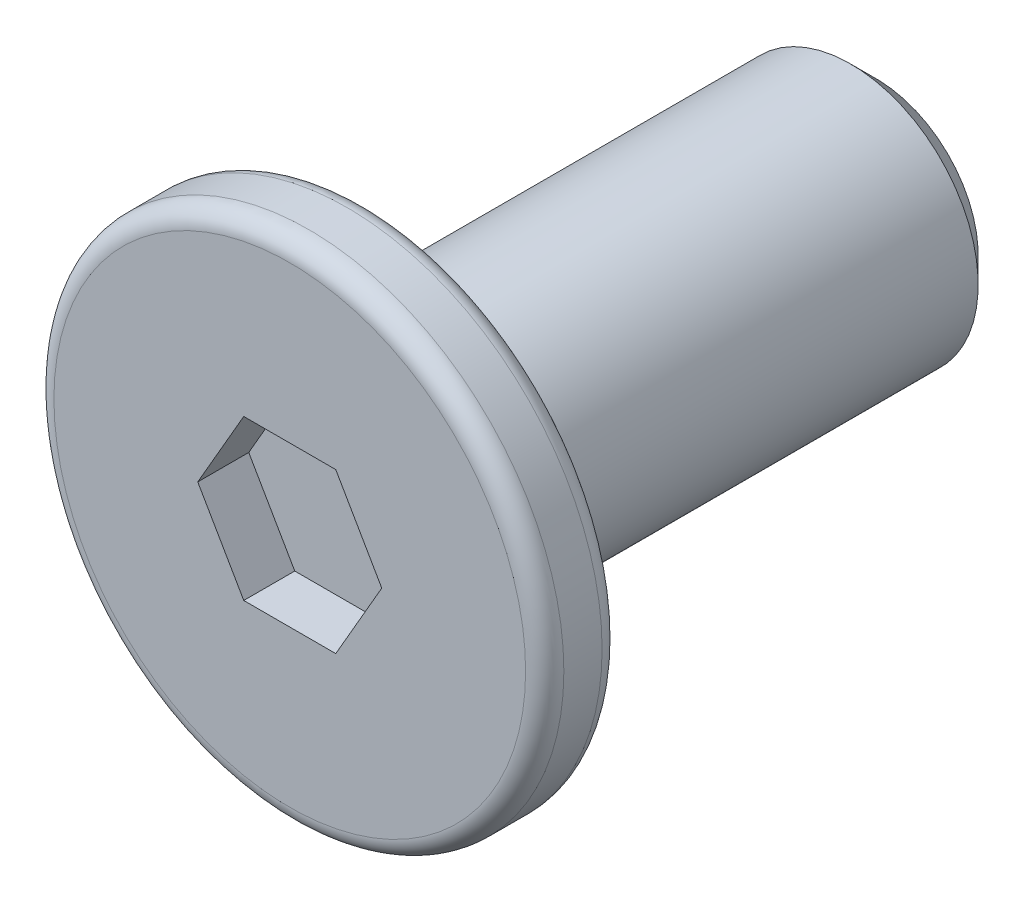
ISO-10303-21;
HEADER;
FILE_DESCRIPTION(('STEP AP214'),'2;1');
FILE_NAME('part.step','',(''),(''),'','','');
FILE_SCHEMA(('AUTOMOTIVE_DESIGN { 1 0 10303 214 1 1 1 1 }'));
ENDSEC;
DATA;
#1=APPLICATION_CONTEXT('core data for automotive mechanical design processes');
#2=APPLICATION_PROTOCOL_DEFINITION('international standard','automotive_design',2000,#1);
#3=PRODUCT_CONTEXT('',#1,'mechanical');
#4=PRODUCT('Part','Part','',(#3));
#5=PRODUCT_RELATED_PRODUCT_CATEGORY('part','',(#4));
#6=PRODUCT_DEFINITION_FORMATION('','',#4);
#7=PRODUCT_DEFINITION_CONTEXT('part definition',#1,'design');
#8=PRODUCT_DEFINITION('design','',#6,#7);
#9=PRODUCT_DEFINITION_SHAPE('','',#8);
#10=(LENGTH_UNIT() NAMED_UNIT(*) SI_UNIT(.MILLI.,.METRE.));
#11=(NAMED_UNIT(*) PLANE_ANGLE_UNIT() SI_UNIT($,.RADIAN.));
#12=(NAMED_UNIT(*) SI_UNIT($,.STERADIAN.) SOLID_ANGLE_UNIT());
#13=UNCERTAINTY_MEASURE_WITH_UNIT(LENGTH_MEASURE(1.E-05),#10,'distance_accuracy_value','');
#14=(GEOMETRIC_REPRESENTATION_CONTEXT(3) GLOBAL_UNCERTAINTY_ASSIGNED_CONTEXT((#13)) GLOBAL_UNIT_ASSIGNED_CONTEXT((#10,
#11,#12)) REPRESENTATION_CONTEXT('',''));
#15=CARTESIAN_POINT('',(0.,0.,0.));
#16=DIRECTION('',(0.,0.,1.));
#17=DIRECTION('',(1.,0.,0.));
#18=AXIS2_PLACEMENT_3D('',#15,#16,#17);
#19=CARTESIAN_POINT('',(0.,0.,0.6));
#20=DIRECTION('',(0.,0.,-1.));
#21=DIRECTION('',(-1.,0.,0.));
#22=AXIS2_PLACEMENT_3D('',#19,#20,#21);
#23=CYLINDRICAL_SURFACE('',#22,4.);
#24=CARTESIAN_POINT('',(0.,0.,-0.3));
#25=DIRECTION('',(0.,0.,1.));
#26=DIRECTION('',(1.,0.,0.));
#27=AXIS2_PLACEMENT_3D('',#24,#25,#26);
#28=CIRCLE('',#27,4.);
#29=CARTESIAN_POINT('',(4.,0.,-0.3));
#30=VERTEX_POINT('',#29);
#31=EDGE_CURVE('E154',#30,#30,#28,.T.);
#32=ORIENTED_EDGE('',*,*,#31,.T.);
#33=EDGE_LOOP('',(#32));
#34=FACE_BOUND('',#33,.T.);
#35=CARTESIAN_POINT('',(0.,0.,0.3));
#36=DIRECTION('',(0.,0.,1.));
#37=DIRECTION('',(1.,0.,0.));
#38=AXIS2_PLACEMENT_3D('',#35,#36,#37);
#39=CIRCLE('',#38,4.);
#40=CARTESIAN_POINT('',(4.,0.,0.3));
#41=VERTEX_POINT('',#40);
#42=EDGE_CURVE('E151',#41,#41,#39,.F.);
#43=ORIENTED_EDGE('',*,*,#42,.T.);
#44=EDGE_LOOP('',(#43));
#45=FACE_BOUND('',#44,.T.);
#46=ADVANCED_FACE('F35',(#34,#45),#23,.T.);
#47=CARTESIAN_POINT('',(0.,0.,0.6));
#48=DIRECTION('',(0.,0.,1.));
#49=DIRECTION('',(1.,0.,0.));
#50=AXIS2_PLACEMENT_3D('',#47,#48,#49);
#51=PLANE('',#50);
#52=CARTESIAN_POINT('',(0.,0.,0.6));
#53=DIRECTION('',(0.,0.,1.));
#54=DIRECTION('',(1.,0.,0.));
#55=AXIS2_PLACEMENT_3D('',#52,#53,#54);
#56=CIRCLE('',#55,3.7);
#57=CARTESIAN_POINT('',(3.7,0.,0.6));
#58=VERTEX_POINT('',#57);
#59=EDGE_CURVE('E11',#58,#58,#56,.T.);
#60=ORIENTED_EDGE('',*,*,#59,.T.);
#61=EDGE_LOOP('',(#60));
#62=FACE_BOUND('',#61,.T.);
#63=DIRECTION('',(0.5,0.866025403784439,0.));
#64=VECTOR('',#63,1.);
#65=CARTESIAN_POINT('',(0.721687836487033,-1.25,0.6));
#66=LINE('',#65,#64);
#67=CARTESIAN_POINT('',(0.721687836487033,-1.25,0.6));
#68=VERTEX_POINT('',#67);
#69=CARTESIAN_POINT('',(1.44337567297407,0.,0.6));
#70=VERTEX_POINT('',#69);
#71=EDGE_CURVE('E50',#68,#70,#66,.T.);
#72=ORIENTED_EDGE('',*,*,#71,.F.);
#73=DIRECTION('',(1.,0.,0.));
#74=VECTOR('',#73,1.);
#75=CARTESIAN_POINT('',(-0.721687836487031,-1.25,0.6));
#76=LINE('',#75,#74);
#77=CARTESIAN_POINT('',(-0.721687836487031,-1.25,0.6));
#78=VERTEX_POINT('',#77);
#79=EDGE_CURVE('E133',#78,#68,#76,.T.);
#80=ORIENTED_EDGE('',*,*,#79,.F.);
#81=DIRECTION('',(0.5,-0.866025403784438,0.));
#82=VECTOR('',#81,1.);
#83=CARTESIAN_POINT('',(-1.44337567297406,0.,0.6));
#84=LINE('',#83,#82);
#85=CARTESIAN_POINT('',(-1.44337567297406,0.,0.6));
#86=VERTEX_POINT('',#85);
#87=EDGE_CURVE('E131',#86,#78,#84,.T.);
#88=ORIENTED_EDGE('',*,*,#87,.F.);
#89=DIRECTION('',(-0.5,-0.866025403784439,0.));
#90=VECTOR('',#89,1.);
#91=CARTESIAN_POINT('',(-0.721687836487032,1.25,0.6));
#92=LINE('',#91,#90);
#93=CARTESIAN_POINT('',(-0.721687836487032,1.25,0.6));
#94=VERTEX_POINT('',#93);
#95=EDGE_CURVE('E98',#94,#86,#92,.T.);
#96=ORIENTED_EDGE('',*,*,#95,.F.);
#97=DIRECTION('',(-1.,0.,0.));
#98=VECTOR('',#97,1.);
#99=CARTESIAN_POINT('',(0.721687836487032,1.25,0.6));
#100=LINE('',#99,#98);
#101=CARTESIAN_POINT('',(0.721687836487032,1.25,0.6));
#102=VERTEX_POINT('',#101);
#103=EDGE_CURVE('E127',#102,#94,#100,.T.);
#104=ORIENTED_EDGE('',*,*,#103,.F.);
#105=DIRECTION('',(-0.500000000000001,0.866025403784438,0.));
#106=VECTOR('',#105,1.);
#107=CARTESIAN_POINT('',(1.44337567297407,0.,0.6));
#108=LINE('',#107,#106);
#109=EDGE_CURVE('E124',#70,#102,#108,.T.);
#110=ORIENTED_EDGE('',*,*,#109,.F.);
#111=EDGE_LOOP('',(#72,#80,#88,#96,#104,#110));
#112=FACE_BOUND('',#111,.T.);
#113=ADVANCED_FACE('F169',(#62,#112),#51,.T.);
#114=CARTESIAN_POINT('',(0.,0.,-0.6));
#115=DIRECTION('',(0.,0.,1.));
#116=DIRECTION('',(1.,0.,0.));
#117=AXIS2_PLACEMENT_3D('',#114,#115,#116);
#118=PLANE('',#117);
#119=CARTESIAN_POINT('',(0.,0.,-0.6));
#120=DIRECTION('',(0.,0.,1.));
#121=DIRECTION('',(1.,0.,0.));
#122=AXIS2_PLACEMENT_3D('',#119,#120,#121);
#123=CIRCLE('',#122,3.7);
#124=CARTESIAN_POINT('',(3.7,0.,-0.6));
#125=VERTEX_POINT('',#124);
#126=EDGE_CURVE('E43',#125,#125,#123,.F.);
#127=ORIENTED_EDGE('',*,*,#126,.T.);
#128=EDGE_LOOP('',(#127));
#129=FACE_BOUND('',#128,.T.);
#130=CARTESIAN_POINT('',(0.,0.,-0.6));
#131=DIRECTION('',(0.,0.,-1.));
#132=DIRECTION('',(-1.,0.,0.));
#133=AXIS2_PLACEMENT_3D('',#130,#131,#132);
#134=CIRCLE('',#133,2.);
#135=CARTESIAN_POINT('',(-2.,0.,-0.6));
#136=VERTEX_POINT('',#135);
#137=EDGE_CURVE('E137',#136,#136,#134,.T.);
#138=ORIENTED_EDGE('',*,*,#137,.F.);
#139=EDGE_LOOP('',(#138));
#140=FACE_BOUND('',#139,.T.);
#141=ADVANCED_FACE('F159',(#129,#140),#118,.F.);
#142=CARTESIAN_POINT('',(0.,0.,-8.6));
#143=DIRECTION('',(0.,0.,1.));
#144=DIRECTION('',(1.,0.,0.));
#145=AXIS2_PLACEMENT_3D('',#142,#143,#144);
#146=CYLINDRICAL_SURFACE('',#145,2.);
#147=CARTESIAN_POINT('',(0.,0.,-8.2));
#148=DIRECTION('',(0.,0.,-1.));
#149=DIRECTION('',(-1.,0.,0.));
#150=AXIS2_PLACEMENT_3D('',#147,#148,#149);
#151=CIRCLE('',#150,2.);
#152=CARTESIAN_POINT('',(-2.,0.,-8.2));
#153=VERTEX_POINT('',#152);
#154=EDGE_CURVE('E148',#153,#153,#151,.F.);
#155=ORIENTED_EDGE('',*,*,#154,.T.);
#156=EDGE_LOOP('',(#155));
#157=FACE_BOUND('',#156,.T.);
#158=ORIENTED_EDGE('',*,*,#137,.T.);
#159=EDGE_LOOP('',(#158));
#160=FACE_BOUND('',#159,.T.);
#161=ADVANCED_FACE('F204',(#157,#160),#146,.T.);
#162=CARTESIAN_POINT('',(0.,0.,-8.6));
#163=DIRECTION('',(0.,0.,-1.));
#164=DIRECTION('',(-1.,0.,0.));
#165=AXIS2_PLACEMENT_3D('',#162,#163,#164);
#166=PLANE('',#165);
#167=CARTESIAN_POINT('',(0.,0.,-8.6));
#168=DIRECTION('',(0.,0.,-1.));
#169=DIRECTION('',(-1.,0.,0.));
#170=AXIS2_PLACEMENT_3D('',#167,#168,#169);
#171=CIRCLE('',#170,1.6);
#172=CARTESIAN_POINT('',(-1.6,0.,-8.6));
#173=VERTEX_POINT('',#172);
#174=EDGE_CURVE('E145',#173,#173,#171,.T.);
#175=ORIENTED_EDGE('',*,*,#174,.T.);
#176=EDGE_LOOP('',(#175));
#177=FACE_BOUND('',#176,.T.);
#178=ADVANCED_FACE('F196',(#177),#166,.T.);
#179=CARTESIAN_POINT('',(0.,0.,-8.6));
#180=DIRECTION('',(0.,0.,1.));
#181=DIRECTION('',(1.,0.,0.));
#182=AXIS2_PLACEMENT_3D('',#179,#180,#181);
#183=CONICAL_SURFACE('',#182,1.6,0.785398163397446);
#184=ORIENTED_EDGE('',*,*,#154,.F.);
#185=EDGE_LOOP('',(#184));
#186=FACE_BOUND('',#185,.T.);
#187=ORIENTED_EDGE('',*,*,#174,.F.);
#188=EDGE_LOOP('',(#187));
#189=FACE_BOUND('',#188,.T.);
#190=ADVANCED_FACE('F189',(#186,#189),#183,.T.);
#191=CARTESIAN_POINT('',(0.721687836487033,-1.25,-0.2));
#192=DIRECTION('',(0.866025403784439,-0.5,0.));
#193=DIRECTION('',(0.5,0.866025403784439,0.));
#194=AXIS2_PLACEMENT_3D('',#191,#192,#193);
#195=PLANE('',#194);
#196=ORIENTED_EDGE('',*,*,#71,.T.);
#197=DIRECTION('',(0.,0.,1.));
#198=VECTOR('',#197,1.);
#199=CARTESIAN_POINT('',(1.44337567297407,0.,-0.2));
#200=LINE('',#199,#198);
#201=CARTESIAN_POINT('',(1.44337567297407,0.,-0.2));
#202=VERTEX_POINT('',#201);
#203=EDGE_CURVE('E80',#202,#70,#200,.T.);
#204=ORIENTED_EDGE('',*,*,#203,.F.);
#205=DIRECTION('',(0.5,0.866025403784439,0.));
#206=VECTOR('',#205,1.);
#207=CARTESIAN_POINT('',(0.721687836487033,-1.25,-0.2));
#208=LINE('',#207,#206);
#209=CARTESIAN_POINT('',(0.721687836487033,-1.25,-0.2));
#210=VERTEX_POINT('',#209);
#211=EDGE_CURVE('E135',#210,#202,#208,.T.);
#212=ORIENTED_EDGE('',*,*,#211,.F.);
#213=DIRECTION('',(0.,0.,1.));
#214=VECTOR('',#213,1.);
#215=CARTESIAN_POINT('',(0.721687836487033,-1.25,-0.2));
#216=LINE('',#215,#214);
#217=EDGE_CURVE('E58',#210,#68,#216,.T.);
#218=ORIENTED_EDGE('',*,*,#217,.T.);
#219=EDGE_LOOP('',(#196,#204,#212,#218));
#220=FACE_BOUND('',#219,.T.);
#221=ADVANCED_FACE('F186',(#220),#195,.F.);
#222=CARTESIAN_POINT('',(-0.721687836487031,-1.25,-0.2));
#223=DIRECTION('',(0.,-1.,0.));
#224=DIRECTION('',(0.,0.,-1.));
#225=AXIS2_PLACEMENT_3D('',#222,#223,#224);
#226=PLANE('',#225);
#227=ORIENTED_EDGE('',*,*,#79,.T.);
#228=ORIENTED_EDGE('',*,*,#217,.F.);
#229=DIRECTION('',(1.,0.,0.));
#230=VECTOR('',#229,1.);
#231=CARTESIAN_POINT('',(-0.721687836487031,-1.25,-0.2));
#232=LINE('',#231,#230);
#233=CARTESIAN_POINT('',(-0.721687836487031,-1.25,-0.2));
#234=VERTEX_POINT('',#233);
#235=EDGE_CURVE('E110',#234,#210,#232,.T.);
#236=ORIENTED_EDGE('',*,*,#235,.F.);
#237=DIRECTION('',(0.,0.,1.));
#238=VECTOR('',#237,1.);
#239=CARTESIAN_POINT('',(-0.721687836487031,-1.25,-0.2));
#240=LINE('',#239,#238);
#241=EDGE_CURVE('E102',#234,#78,#240,.T.);
#242=ORIENTED_EDGE('',*,*,#241,.T.);
#243=EDGE_LOOP('',(#227,#228,#236,#242));
#244=FACE_BOUND('',#243,.T.);
#245=ADVANCED_FACE('F188',(#244),#226,.F.);
#246=CARTESIAN_POINT('',(-1.44337567297406,0.,-0.2));
#247=DIRECTION('',(-0.866025403784438,-0.5,0.));
#248=DIRECTION('',(0.5,-0.866025403784438,0.));
#249=AXIS2_PLACEMENT_3D('',#246,#247,#248);
#250=PLANE('',#249);
#251=ORIENTED_EDGE('',*,*,#87,.T.);
#252=ORIENTED_EDGE('',*,*,#241,.F.);
#253=DIRECTION('',(0.5,-0.866025403784438,0.));
#254=VECTOR('',#253,1.);
#255=CARTESIAN_POINT('',(-1.44337567297406,0.,-0.2));
#256=LINE('',#255,#254);
#257=CARTESIAN_POINT('',(-1.44337567297406,0.,-0.2));
#258=VERTEX_POINT('',#257);
#259=EDGE_CURVE('E106',#258,#234,#256,.T.);
#260=ORIENTED_EDGE('',*,*,#259,.F.);
#261=DIRECTION('',(0.,0.,1.));
#262=VECTOR('',#261,1.);
#263=CARTESIAN_POINT('',(-1.44337567297406,0.,-0.2));
#264=LINE('',#263,#262);
#265=EDGE_CURVE('E91',#258,#86,#264,.T.);
#266=ORIENTED_EDGE('',*,*,#265,.T.);
#267=EDGE_LOOP('',(#251,#252,#260,#266));
#268=FACE_BOUND('',#267,.T.);
#269=ADVANCED_FACE('F107',(#268),#250,.F.);
#270=CARTESIAN_POINT('',(-0.721687836487032,1.25,-0.2));
#271=DIRECTION('',(-0.866025403784439,0.5,0.));
#272=DIRECTION('',(-0.5,-0.866025403784439,0.));
#273=AXIS2_PLACEMENT_3D('',#270,#271,#272);
#274=PLANE('',#273);
#275=ORIENTED_EDGE('',*,*,#95,.T.);
#276=ORIENTED_EDGE('',*,*,#265,.F.);
#277=DIRECTION('',(-0.5,-0.866025403784439,0.));
#278=VECTOR('',#277,1.);
#279=CARTESIAN_POINT('',(-0.721687836487032,1.25,-0.2));
#280=LINE('',#279,#278);
#281=CARTESIAN_POINT('',(-0.721687836487032,1.25,-0.2));
#282=VERTEX_POINT('',#281);
#283=EDGE_CURVE('E95',#282,#258,#280,.T.);
#284=ORIENTED_EDGE('',*,*,#283,.F.);
#285=DIRECTION('',(0.,0.,1.));
#286=VECTOR('',#285,1.);
#287=CARTESIAN_POINT('',(-0.721687836487032,1.25,-0.2));
#288=LINE('',#287,#286);
#289=EDGE_CURVE('E103',#282,#94,#288,.T.);
#290=ORIENTED_EDGE('',*,*,#289,.T.);
#291=EDGE_LOOP('',(#275,#276,#284,#290));
#292=FACE_BOUND('',#291,.T.);
#293=ADVANCED_FACE('F93',(#292),#274,.F.);
#294=CARTESIAN_POINT('',(0.721687836487032,1.25,-0.2));
#295=DIRECTION('',(0.,1.,0.));
#296=DIRECTION('',(0.,0.,1.));
#297=AXIS2_PLACEMENT_3D('',#294,#295,#296);
#298=PLANE('',#297);
#299=ORIENTED_EDGE('',*,*,#103,.T.);
#300=ORIENTED_EDGE('',*,*,#289,.F.);
#301=DIRECTION('',(-1.,0.,0.));
#302=VECTOR('',#301,1.);
#303=CARTESIAN_POINT('',(0.721687836487032,1.25,-0.2));
#304=LINE('',#303,#302);
#305=CARTESIAN_POINT('',(0.721687836487032,1.25,-0.2));
#306=VERTEX_POINT('',#305);
#307=EDGE_CURVE('E116',#306,#282,#304,.T.);
#308=ORIENTED_EDGE('',*,*,#307,.F.);
#309=DIRECTION('',(0.,0.,1.));
#310=VECTOR('',#309,1.);
#311=CARTESIAN_POINT('',(0.721687836487032,1.25,-0.2));
#312=LINE('',#311,#310);
#313=EDGE_CURVE('E140',#306,#102,#312,.T.);
#314=ORIENTED_EDGE('',*,*,#313,.T.);
#315=EDGE_LOOP('',(#299,#300,#308,#314));
#316=FACE_BOUND('',#315,.T.);
#317=ADVANCED_FACE('F257',(#316),#298,.F.);
#318=CARTESIAN_POINT('',(1.44337567297407,0.,-0.2));
#319=DIRECTION('',(0.866025403784438,0.500000000000001,0.));
#320=DIRECTION('',(-0.500000000000001,0.866025403784438,0.));
#321=AXIS2_PLACEMENT_3D('',#318,#319,#320);
#322=PLANE('',#321);
#323=ORIENTED_EDGE('',*,*,#109,.T.);
#324=ORIENTED_EDGE('',*,*,#313,.F.);
#325=DIRECTION('',(-0.500000000000001,0.866025403784438,0.));
#326=VECTOR('',#325,1.);
#327=CARTESIAN_POINT('',(1.44337567297407,0.,-0.2));
#328=LINE('',#327,#326);
#329=EDGE_CURVE('E118',#202,#306,#328,.T.);
#330=ORIENTED_EDGE('',*,*,#329,.F.);
#331=ORIENTED_EDGE('',*,*,#203,.T.);
#332=EDGE_LOOP('',(#323,#324,#330,#331));
#333=FACE_BOUND('',#332,.T.);
#334=ADVANCED_FACE('F184',(#333),#322,.F.);
#335=CARTESIAN_POINT('',(0.,0.,-0.2));
#336=DIRECTION('',(0.,0.,1.));
#337=DIRECTION('',(1.,0.,0.));
#338=AXIS2_PLACEMENT_3D('',#335,#336,#337);
#339=PLANE('',#338);
#340=ORIENTED_EDGE('',*,*,#211,.T.);
#341=ORIENTED_EDGE('',*,*,#329,.T.);
#342=ORIENTED_EDGE('',*,*,#307,.T.);
#343=ORIENTED_EDGE('',*,*,#283,.T.);
#344=ORIENTED_EDGE('',*,*,#259,.T.);
#345=ORIENTED_EDGE('',*,*,#235,.T.);
#346=EDGE_LOOP('',(#340,#341,#342,#343,#344,#345));
#347=FACE_BOUND('',#346,.T.);
#348=ADVANCED_FACE('F113',(#347),#339,.T.);
#349=CARTESIAN_POINT('',(0.,0.,-0.3));
#350=DIRECTION('',(0.,0.,1.));
#351=DIRECTION('',(1.,0.,0.));
#352=AXIS2_PLACEMENT_3D('',#349,#350,#351);
#353=TOROIDAL_SURFACE('',#352,3.7,0.3);
#354=ORIENTED_EDGE('',*,*,#126,.F.);
#355=EDGE_LOOP('',(#354));
#356=FACE_BOUND('',#355,.T.);
#357=ORIENTED_EDGE('',*,*,#31,.F.);
#358=EDGE_LOOP('',(#357));
#359=FACE_BOUND('',#358,.T.);
#360=ADVANCED_FACE('F162',(#356,#359),#353,.T.);
#361=CARTESIAN_POINT('',(0.,0.,0.3));
#362=DIRECTION('',(0.,0.,1.));
#363=DIRECTION('',(1.,0.,0.));
#364=AXIS2_PLACEMENT_3D('',#361,#362,#363);
#365=TOROIDAL_SURFACE('',#364,3.7,0.3);
#366=ORIENTED_EDGE('',*,*,#42,.F.);
#367=EDGE_LOOP('',(#366));
#368=FACE_BOUND('',#367,.T.);
#369=ORIENTED_EDGE('',*,*,#59,.F.);
#370=EDGE_LOOP('',(#369));
#371=FACE_BOUND('',#370,.T.);
#372=ADVANCED_FACE('F37',(#368,#371),#365,.T.);
#373=CLOSED_SHELL('',(#46,#113,#141,#161,#178,#190,#221,#245,#269,#293,#317,#334,#348,#360,#372));
#374=MANIFOLD_SOLID_BREP('B2',#373);
#375=ADVANCED_BREP_SHAPE_REPRESENTATION('',(#18,#374),#14);
#376=SHAPE_DEFINITION_REPRESENTATION(#9,#375);
ENDSEC;
END-ISO-10303-21;
